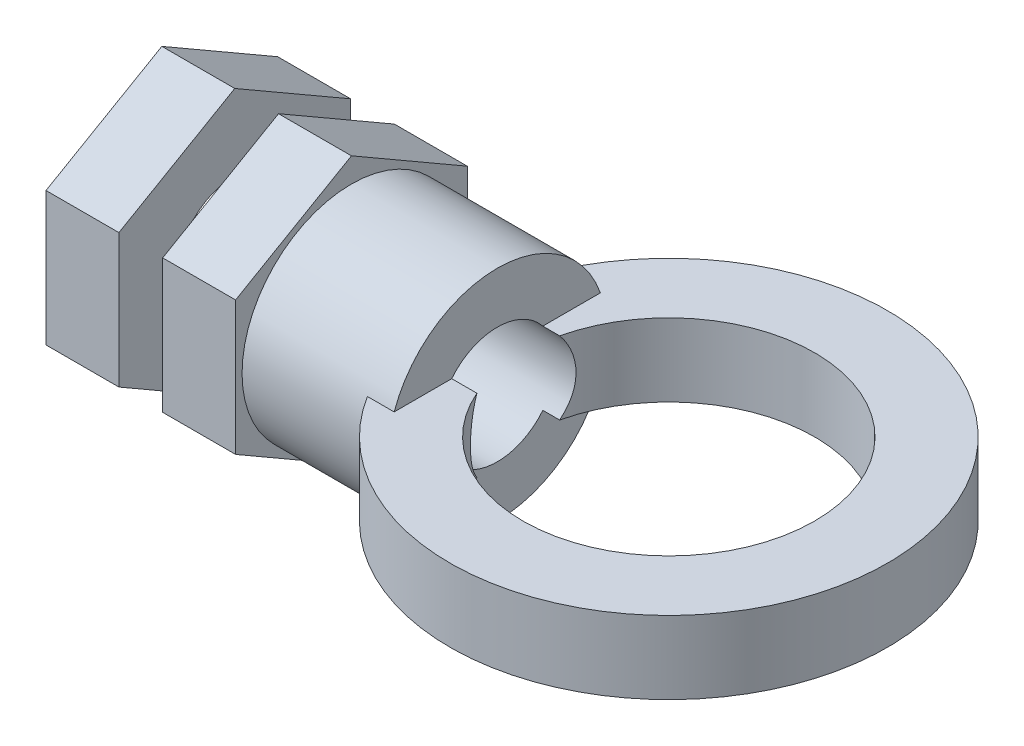
ISO-10303-21;
HEADER;
FILE_DESCRIPTION(('STEP AP214'),'2;1');
FILE_NAME('part.step','',(''),(''),'','','');
FILE_SCHEMA(('AUTOMOTIVE_DESIGN { 1 0 10303 214 1 1 1 1 }'));
ENDSEC;
DATA;
#1=APPLICATION_CONTEXT('core data for automotive mechanical design processes');
#2=APPLICATION_PROTOCOL_DEFINITION('international standard','automotive_design',2000,#1);
#3=PRODUCT_CONTEXT('',#1,'mechanical');
#4=PRODUCT('Part','Part','',(#3));
#5=PRODUCT_RELATED_PRODUCT_CATEGORY('part','',(#4));
#6=PRODUCT_DEFINITION_FORMATION('','',#4);
#7=PRODUCT_DEFINITION_CONTEXT('part definition',#1,'design');
#8=PRODUCT_DEFINITION('design','',#6,#7);
#9=PRODUCT_DEFINITION_SHAPE('','',#8);
#10=(LENGTH_UNIT() NAMED_UNIT(*) SI_UNIT(.MILLI.,.METRE.));
#11=(NAMED_UNIT(*) PLANE_ANGLE_UNIT() SI_UNIT($,.RADIAN.));
#12=(NAMED_UNIT(*) SI_UNIT($,.STERADIAN.) SOLID_ANGLE_UNIT());
#13=UNCERTAINTY_MEASURE_WITH_UNIT(LENGTH_MEASURE(1.E-05),#10,'distance_accuracy_value','');
#14=(GEOMETRIC_REPRESENTATION_CONTEXT(3) GLOBAL_UNCERTAINTY_ASSIGNED_CONTEXT((#13)) GLOBAL_UNIT_ASSIGNED_CONTEXT((#10,
#11,#12)) REPRESENTATION_CONTEXT('',''));
#15=CARTESIAN_POINT('',(0.,0.,0.));
#16=DIRECTION('',(0.,0.,1.));
#17=DIRECTION('',(1.,0.,0.));
#18=AXIS2_PLACEMENT_3D('',#15,#16,#17);
#19=CARTESIAN_POINT('',(-13.,-4.58670881317867,7.94441270394918));
#20=DIRECTION('',(0.,-0.866025403784442,0.499999999999995));
#21=DIRECTION('',(0.,-0.499999999999995,-0.866025403784442));
#22=AXIS2_PLACEMENT_3D('',#19,#20,#21);
#23=PLANE('',#22);
#24=DIRECTION('',(0.,-0.499999999999995,-0.866025403784442));
#25=VECTOR('',#24,1.);
#26=CARTESIAN_POINT('',(-8.,-4.58670881317867,7.94441270394918));
#27=LINE('',#26,#25);
#28=CARTESIAN_POINT('',(-8.,-4.58670881317867,7.94441270394918));
#29=VERTEX_POINT('',#28);
#30=CARTESIAN_POINT('',(-8.,-9.17341762635715,0.));
#31=VERTEX_POINT('',#30);
#32=EDGE_CURVE('E134',#29,#31,#27,.T.);
#33=ORIENTED_EDGE('',*,*,#32,.F.);
#34=DIRECTION('',(1.,0.,0.));
#35=VECTOR('',#34,1.);
#36=CARTESIAN_POINT('',(-13.,-4.58670881317867,7.94441270394918));
#37=LINE('',#36,#35);
#38=CARTESIAN_POINT('',(-13.,-4.58670881317867,7.94441270394918));
#39=VERTEX_POINT('',#38);
#40=EDGE_CURVE('E12',#39,#29,#37,.T.);
#41=ORIENTED_EDGE('',*,*,#40,.F.);
#42=DIRECTION('',(0.,-0.499999999999995,-0.866025403784442));
#43=VECTOR('',#42,1.);
#44=CARTESIAN_POINT('',(-13.,-4.58670881317867,7.94441270394918));
#45=LINE('',#44,#43);
#46=CARTESIAN_POINT('',(-13.,-9.17341762635715,0.));
#47=VERTEX_POINT('',#46);
#48=EDGE_CURVE('E148',#39,#47,#45,.T.);
#49=ORIENTED_EDGE('',*,*,#48,.T.);
#50=DIRECTION('',(1.,0.,0.));
#51=VECTOR('',#50,1.);
#52=CARTESIAN_POINT('',(-13.,-9.17341762635715,0.));
#53=LINE('',#52,#51);
#54=EDGE_CURVE('E98',#47,#31,#53,.T.);
#55=ORIENTED_EDGE('',*,*,#54,.T.);
#56=EDGE_LOOP('',(#33,#41,#49,#55));
#57=FACE_BOUND('',#56,.T.);
#58=ADVANCED_FACE('F48',(#57),#23,.T.);
#59=CARTESIAN_POINT('',(-13.,4.5867088131785,7.94441270394928));
#60=DIRECTION('',(0.,0.,1.));
#61=DIRECTION('',(0.,-1.,0.));
#62=AXIS2_PLACEMENT_3D('',#59,#60,#61);
#63=PLANE('',#62);
#64=DIRECTION('',(0.,-1.,0.));
#65=VECTOR('',#64,1.);
#66=CARTESIAN_POINT('',(-8.,4.5867088131785,7.94441270394928));
#67=LINE('',#66,#65);
#68=CARTESIAN_POINT('',(-8.,4.5867088131785,7.94441270394928));
#69=VERTEX_POINT('',#68);
#70=EDGE_CURVE('E146',#69,#29,#67,.T.);
#71=ORIENTED_EDGE('',*,*,#70,.F.);
#72=DIRECTION('',(1.,0.,0.));
#73=VECTOR('',#72,1.);
#74=CARTESIAN_POINT('',(-13.,4.5867088131785,7.94441270394928));
#75=LINE('',#74,#73);
#76=CARTESIAN_POINT('',(-13.,4.5867088131785,7.94441270394928));
#77=VERTEX_POINT('',#76);
#78=EDGE_CURVE('E57',#77,#69,#75,.T.);
#79=ORIENTED_EDGE('',*,*,#78,.F.);
#80=DIRECTION('',(0.,-1.,0.));
#81=VECTOR('',#80,1.);
#82=CARTESIAN_POINT('',(-13.,4.5867088131785,7.94441270394928));
#83=LINE('',#82,#81);
#84=EDGE_CURVE('E124',#77,#39,#83,.T.);
#85=ORIENTED_EDGE('',*,*,#84,.T.);
#86=ORIENTED_EDGE('',*,*,#40,.T.);
#87=EDGE_LOOP('',(#71,#79,#85,#86));
#88=FACE_BOUND('',#87,.T.);
#89=ADVANCED_FACE('F157',(#88),#63,.T.);
#90=CARTESIAN_POINT('',(-13.,9.17341762635715,0.));
#91=DIRECTION('',(0.,0.866025403784435,0.500000000000007));
#92=DIRECTION('',(0.,-0.500000000000007,0.866025403784435));
#93=AXIS2_PLACEMENT_3D('',#90,#91,#92);
#94=PLANE('',#93);
#95=DIRECTION('',(0.,-0.500000000000007,0.866025403784434));
#96=VECTOR('',#95,1.);
#97=CARTESIAN_POINT('',(-8.,9.17341762635715,0.));
#98=LINE('',#97,#96);
#99=CARTESIAN_POINT('',(-8.,9.17341762635715,0.));
#100=VERTEX_POINT('',#99);
#101=EDGE_CURVE('E111',#100,#69,#98,.T.);
#102=ORIENTED_EDGE('',*,*,#101,.F.);
#103=DIRECTION('',(1.,0.,0.));
#104=VECTOR('',#103,1.);
#105=CARTESIAN_POINT('',(-13.,9.17341762635715,0.));
#106=LINE('',#105,#104);
#107=CARTESIAN_POINT('',(-13.,9.17341762635715,0.));
#108=VERTEX_POINT('',#107);
#109=EDGE_CURVE('E106',#108,#100,#106,.T.);
#110=ORIENTED_EDGE('',*,*,#109,.F.);
#111=DIRECTION('',(0.,-0.500000000000007,0.866025403784434));
#112=VECTOR('',#111,1.);
#113=CARTESIAN_POINT('',(-13.,9.17341762635715,0.));
#114=LINE('',#113,#112);
#115=EDGE_CURVE('E109',#108,#77,#114,.T.);
#116=ORIENTED_EDGE('',*,*,#115,.T.);
#117=ORIENTED_EDGE('',*,*,#78,.T.);
#118=EDGE_LOOP('',(#102,#110,#116,#117));
#119=FACE_BOUND('',#118,.T.);
#120=ADVANCED_FACE('F108',(#119),#94,.T.);
#121=CARTESIAN_POINT('',(-13.,4.58670881317861,-7.94441270394922));
#122=DIRECTION('',(0.,0.866025403784442,-0.499999999999995));
#123=DIRECTION('',(0.,0.499999999999995,0.866025403784442));
#124=AXIS2_PLACEMENT_3D('',#121,#122,#123);
#125=PLANE('',#124);
#126=DIRECTION('',(0.,0.499999999999995,0.866025403784441));
#127=VECTOR('',#126,1.);
#128=CARTESIAN_POINT('',(-8.,4.58670881317861,-7.94441270394922));
#129=LINE('',#128,#127);
#130=CARTESIAN_POINT('',(-8.,4.58670881317861,-7.94441270394922));
#131=VERTEX_POINT('',#130);
#132=EDGE_CURVE('E143',#131,#100,#129,.T.);
#133=ORIENTED_EDGE('',*,*,#132,.F.);
#134=DIRECTION('',(1.,0.,0.));
#135=VECTOR('',#134,1.);
#136=CARTESIAN_POINT('',(-13.,4.58670881317861,-7.94441270394922));
#137=LINE('',#136,#135);
#138=CARTESIAN_POINT('',(-13.,4.58670881317861,-7.94441270394922));
#139=VERTEX_POINT('',#138);
#140=EDGE_CURVE('E116',#139,#131,#137,.T.);
#141=ORIENTED_EDGE('',*,*,#140,.F.);
#142=DIRECTION('',(0.,0.499999999999995,0.866025403784441));
#143=VECTOR('',#142,1.);
#144=CARTESIAN_POINT('',(-13.,4.58670881317861,-7.94441270394922));
#145=LINE('',#144,#143);
#146=EDGE_CURVE('E122',#139,#108,#145,.T.);
#147=ORIENTED_EDGE('',*,*,#146,.T.);
#148=ORIENTED_EDGE('',*,*,#109,.T.);
#149=EDGE_LOOP('',(#133,#141,#147,#148));
#150=FACE_BOUND('',#149,.T.);
#151=ADVANCED_FACE('F126',(#150),#125,.T.);
#152=CARTESIAN_POINT('',(-13.,-4.58670881317856,-7.94441270394925));
#153=DIRECTION('',(0.,0.,-1.));
#154=DIRECTION('',(0.,1.,0.));
#155=AXIS2_PLACEMENT_3D('',#152,#153,#154);
#156=PLANE('',#155);
#157=DIRECTION('',(0.,1.,0.));
#158=VECTOR('',#157,1.);
#159=CARTESIAN_POINT('',(-8.,-4.58670881317856,-7.94441270394925));
#160=LINE('',#159,#158);
#161=CARTESIAN_POINT('',(-8.,-4.58670881317856,-7.94441270394925));
#162=VERTEX_POINT('',#161);
#163=EDGE_CURVE('E140',#162,#131,#160,.T.);
#164=ORIENTED_EDGE('',*,*,#163,.F.);
#165=DIRECTION('',(1.,0.,0.));
#166=VECTOR('',#165,1.);
#167=CARTESIAN_POINT('',(-13.,-4.58670881317856,-7.94441270394925));
#168=LINE('',#167,#166);
#169=CARTESIAN_POINT('',(-13.,-4.58670881317856,-7.94441270394925));
#170=VERTEX_POINT('',#169);
#171=EDGE_CURVE('E152',#170,#162,#168,.T.);
#172=ORIENTED_EDGE('',*,*,#171,.F.);
#173=DIRECTION('',(0.,1.,0.));
#174=VECTOR('',#173,1.);
#175=CARTESIAN_POINT('',(-13.,-4.58670881317856,-7.94441270394925));
#176=LINE('',#175,#174);
#177=EDGE_CURVE('E127',#170,#139,#176,.T.);
#178=ORIENTED_EDGE('',*,*,#177,.T.);
#179=ORIENTED_EDGE('',*,*,#140,.T.);
#180=EDGE_LOOP('',(#164,#172,#178,#179));
#181=FACE_BOUND('',#180,.T.);
#182=ADVANCED_FACE('F170',(#181),#156,.T.);
#183=CARTESIAN_POINT('',(-13.,-9.17341762635715,0.));
#184=DIRECTION('',(0.,-0.866025403784438,-0.500000000000001));
#185=DIRECTION('',(0.,0.500000000000001,-0.866025403784438));
#186=AXIS2_PLACEMENT_3D('',#183,#184,#185);
#187=PLANE('',#186);
#188=DIRECTION('',(0.,0.500000000000001,-0.866025403784438));
#189=VECTOR('',#188,1.);
#190=CARTESIAN_POINT('',(-8.,-9.17341762635715,0.));
#191=LINE('',#190,#189);
#192=EDGE_CURVE('E137',#31,#162,#191,.T.);
#193=ORIENTED_EDGE('',*,*,#192,.F.);
#194=ORIENTED_EDGE('',*,*,#54,.F.);
#195=DIRECTION('',(0.,0.500000000000001,-0.866025403784438));
#196=VECTOR('',#195,1.);
#197=CARTESIAN_POINT('',(-13.,-9.17341762635715,0.));
#198=LINE('',#197,#196);
#199=EDGE_CURVE('E129',#47,#170,#198,.T.);
#200=ORIENTED_EDGE('',*,*,#199,.T.);
#201=ORIENTED_EDGE('',*,*,#171,.T.);
#202=EDGE_LOOP('',(#193,#194,#200,#201));
#203=FACE_BOUND('',#202,.T.);
#204=ADVANCED_FACE('F153',(#203),#187,.T.);
#205=CARTESIAN_POINT('',(-13.,0.,0.));
#206=DIRECTION('',(1.,0.,0.));
#207=DIRECTION('',(0.,0.,-1.));
#208=AXIS2_PLACEMENT_3D('',#205,#206,#207);
#209=PLANE('',#208);
#210=CARTESIAN_POINT('',(-13.,0.,0.));
#211=DIRECTION('',(1.,0.,0.));
#212=DIRECTION('',(0.,0.,-1.));
#213=AXIS2_PLACEMENT_3D('',#210,#211,#212);
#214=CIRCLE('',#213,4.);
#215=CARTESIAN_POINT('',(-13.,0.,-4.));
#216=VERTEX_POINT('',#215);
#217=EDGE_CURVE('E193',#216,#216,#214,.T.);
#218=ORIENTED_EDGE('',*,*,#217,.T.);
#219=EDGE_LOOP('',(#218));
#220=FACE_BOUND('',#219,.T.);
#221=ORIENTED_EDGE('',*,*,#48,.F.);
#222=ORIENTED_EDGE('',*,*,#84,.F.);
#223=ORIENTED_EDGE('',*,*,#115,.F.);
#224=ORIENTED_EDGE('',*,*,#146,.F.);
#225=ORIENTED_EDGE('',*,*,#177,.F.);
#226=ORIENTED_EDGE('',*,*,#199,.F.);
#227=EDGE_LOOP('',(#221,#222,#223,#224,#225,#226));
#228=FACE_BOUND('',#227,.T.);
#229=ADVANCED_FACE('F120',(#220,#228),#209,.F.);
#230=CARTESIAN_POINT('',(-8.,0.,0.));
#231=DIRECTION('',(1.,0.,0.));
#232=DIRECTION('',(0.,0.,-1.));
#233=AXIS2_PLACEMENT_3D('',#230,#231,#232);
#234=PLANE('',#233);
#235=CARTESIAN_POINT('',(-8.,0.,0.));
#236=DIRECTION('',(1.,0.,0.));
#237=DIRECTION('',(0.,0.,-1.));
#238=AXIS2_PLACEMENT_3D('',#235,#236,#237);
#239=CIRCLE('',#238,4.);
#240=CARTESIAN_POINT('',(-8.,0.,-4.));
#241=VERTEX_POINT('',#240);
#242=EDGE_CURVE('E51',#241,#241,#239,.T.);
#243=ORIENTED_EDGE('',*,*,#242,.F.);
#244=EDGE_LOOP('',(#243));
#245=FACE_BOUND('',#244,.T.);
#246=ORIENTED_EDGE('',*,*,#32,.T.);
#247=ORIENTED_EDGE('',*,*,#192,.T.);
#248=ORIENTED_EDGE('',*,*,#163,.T.);
#249=ORIENTED_EDGE('',*,*,#132,.T.);
#250=ORIENTED_EDGE('',*,*,#101,.T.);
#251=ORIENTED_EDGE('',*,*,#70,.T.);
#252=EDGE_LOOP('',(#246,#247,#248,#249,#250,#251));
#253=FACE_BOUND('',#252,.T.);
#254=ADVANCED_FACE('F156',(#245,#253),#234,.T.);
#255=CARTESIAN_POINT('',(-13.,0.,0.));
#256=DIRECTION('',(1.,0.,0.));
#257=DIRECTION('',(0.,0.,-1.));
#258=AXIS2_PLACEMENT_3D('',#255,#256,#257);
#259=CYLINDRICAL_SURFACE('',#258,4.);
#260=ORIENTED_EDGE('',*,*,#242,.T.);
#261=EDGE_LOOP('',(#260));
#262=FACE_BOUND('',#261,.T.);
#263=ORIENTED_EDGE('',*,*,#217,.F.);
#264=EDGE_LOOP('',(#263));
#265=FACE_BOUND('',#264,.T.);
#266=ADVANCED_FACE('F181',(#262,#265),#259,.F.);
#267=CLOSED_SHELL('',(#58,#89,#120,#151,#182,#204,#229,#254,#266));
#268=MANIFOLD_SOLID_BREP('B2',#267);
#269=CARTESIAN_POINT('',(20.8966829811401,2.5,-0.863950162018484));
#270=DIRECTION('',(0.,1.,0.));
#271=DIRECTION('',(0.,0.,1.));
#272=AXIS2_PLACEMENT_3D('',#269,#270,#271);
#273=PLANE('',#272);
#274=DIRECTION('',(0.,0.,1.));
#275=VECTOR('',#274,1.);
#276=CARTESIAN_POINT('',(10.,2.5,0.));
#277=LINE('',#276,#275);
#278=CARTESIAN_POINT('',(10.,2.5,-7.07106781186548));
#279=VERTEX_POINT('',#278);
#280=CARTESIAN_POINT('',(10.,2.5,-3.1224989991992));
#281=VERTEX_POINT('',#280);
#282=EDGE_CURVE('E588',#279,#281,#277,.T.);
#283=ORIENTED_EDGE('',*,*,#282,.T.);
#284=DIRECTION('',(-1.,0.,0.));
#285=VECTOR('',#284,1.);
#286=CARTESIAN_POINT('',(35.8976829811401,2.5,-3.1224989991992));
#287=LINE('',#286,#285);
#288=CARTESIAN_POINT('',(11.1550734041723,2.5,-3.1224989991992));
#289=VERTEX_POINT('',#288);
#290=EDGE_CURVE('E499',#289,#281,#287,.T.);
#291=ORIENTED_EDGE('',*,*,#290,.F.);
#292=CARTESIAN_POINT('',(20.8966829811401,2.5,-0.863950162018484));
#293=DIRECTION('',(0.,1.,0.));
#294=DIRECTION('',(0.,0.,1.));
#295=AXIS2_PLACEMENT_3D('',#292,#293,#294);
#296=CIRCLE('',#295,10.);
#297=CARTESIAN_POINT('',(11.7256294383334,2.5,3.1224989991992));
#298=VERTEX_POINT('',#297);
#299=EDGE_CURVE('E394',#298,#289,#296,.T.);
#300=ORIENTED_EDGE('',*,*,#299,.F.);
#301=DIRECTION('',(-1.,0.,0.));
#302=VECTOR('',#301,1.);
#303=CARTESIAN_POINT('',(10.,2.5,3.1224989991992));
#304=LINE('',#303,#302);
#305=CARTESIAN_POINT('',(10.,2.5,3.1224989991992));
#306=VERTEX_POINT('',#305);
#307=EDGE_CURVE('E274',#306,#298,#304,.F.);
#308=ORIENTED_EDGE('',*,*,#307,.F.);
#309=CARTESIAN_POINT('',(10.,2.5,7.07106781186548));
#310=VERTEX_POINT('',#309);
#311=EDGE_CURVE('E592',#306,#310,#277,.T.);
#312=ORIENTED_EDGE('',*,*,#311,.T.);
#313=DIRECTION('',(-1.,0.,0.));
#314=VECTOR('',#313,1.);
#315=CARTESIAN_POINT('',(10.,2.5,7.07106781186548));
#316=LINE('',#315,#314);
#317=CARTESIAN_POINT('',(8.16736682691801,2.5,7.07106781186548));
#318=VERTEX_POINT('',#317);
#319=EDGE_CURVE('E595',#318,#310,#316,.F.);
#320=ORIENTED_EDGE('',*,*,#319,.F.);
#321=CARTESIAN_POINT('',(20.8966829811401,2.5,-0.863950162018484));
#322=DIRECTION('',(0.,1.,0.));
#323=DIRECTION('',(0.,0.,1.));
#324=AXIS2_PLACEMENT_3D('',#321,#322,#323);
#325=CIRCLE('',#324,15.);
#326=CARTESIAN_POINT('',(7.24121922186194,2.5,-7.07106781186548));
#327=VERTEX_POINT('',#326);
#328=EDGE_CURVE('E406',#318,#327,#325,.T.);
#329=ORIENTED_EDGE('',*,*,#328,.T.);
#330=DIRECTION('',(-1.,0.,0.));
#331=VECTOR('',#330,1.);
#332=CARTESIAN_POINT('',(10.,2.5,-7.07106781186548));
#333=LINE('',#332,#331);
#334=EDGE_CURVE('E584',#279,#327,#333,.T.);
#335=ORIENTED_EDGE('',*,*,#334,.F.);
#336=EDGE_LOOP('',(#283,#291,#300,#308,#312,#320,#329,#335));
#337=FACE_BOUND('',#336,.T.);
#338=ADVANCED_FACE('F244',(#337),#273,.T.);
#339=CARTESIAN_POINT('',(20.8966829811401,-2.5,-0.863950162018484));
#340=DIRECTION('',(0.,1.,0.));
#341=DIRECTION('',(0.,0.,1.));
#342=AXIS2_PLACEMENT_3D('',#339,#340,#341);
#343=PLANE('',#342);
#344=DIRECTION('',(-1.,0.,0.));
#345=VECTOR('',#344,1.);
#346=CARTESIAN_POINT('',(35.8976829811401,-2.5,-3.1224989991992));
#347=LINE('',#346,#345);
#348=CARTESIAN_POINT('',(11.1550734041723,-2.5,-3.1224989991992));
#349=VERTEX_POINT('',#348);
#350=CARTESIAN_POINT('',(10.,-2.5,-3.1224989991992));
#351=VERTEX_POINT('',#350);
#352=EDGE_CURVE('E265',#349,#351,#347,.T.);
#353=ORIENTED_EDGE('',*,*,#352,.T.);
#354=DIRECTION('',(0.,0.,1.));
#355=VECTOR('',#354,1.);
#356=CARTESIAN_POINT('',(10.,-2.5,0.));
#357=LINE('',#356,#355);
#358=CARTESIAN_POINT('',(10.,-2.5,-7.07106781186548));
#359=VERTEX_POINT('',#358);
#360=EDGE_CURVE('E593',#359,#351,#357,.T.);
#361=ORIENTED_EDGE('',*,*,#360,.F.);
#362=DIRECTION('',(-1.,0.,0.));
#363=VECTOR('',#362,1.);
#364=CARTESIAN_POINT('',(10.,-2.5,-7.07106781186548));
#365=LINE('',#364,#363);
#366=CARTESIAN_POINT('',(7.24121922186194,-2.5,-7.07106781186548));
#367=VERTEX_POINT('',#366);
#368=EDGE_CURVE('E590',#359,#367,#365,.T.);
#369=ORIENTED_EDGE('',*,*,#368,.T.);
#370=CARTESIAN_POINT('',(20.8966829811401,-2.5,-0.863950162018484));
#371=DIRECTION('',(0.,1.,0.));
#372=DIRECTION('',(0.,0.,1.));
#373=AXIS2_PLACEMENT_3D('',#370,#371,#372);
#374=CIRCLE('',#373,15.);
#375=CARTESIAN_POINT('',(8.16736682691801,-2.5,7.07106781186548));
#376=VERTEX_POINT('',#375);
#377=EDGE_CURVE('E399',#376,#367,#374,.T.);
#378=ORIENTED_EDGE('',*,*,#377,.F.);
#379=DIRECTION('',(-1.,0.,0.));
#380=VECTOR('',#379,1.);
#381=CARTESIAN_POINT('',(10.,-2.5,7.07106781186548));
#382=LINE('',#381,#380);
#383=CARTESIAN_POINT('',(10.,-2.5,7.07106781186548));
#384=VERTEX_POINT('',#383);
#385=EDGE_CURVE('E599',#376,#384,#382,.F.);
#386=ORIENTED_EDGE('',*,*,#385,.T.);
#387=CARTESIAN_POINT('',(10.,-2.5,3.1224989991992));
#388=VERTEX_POINT('',#387);
#389=EDGE_CURVE('E388',#388,#384,#357,.T.);
#390=ORIENTED_EDGE('',*,*,#389,.F.);
#391=DIRECTION('',(-1.,0.,0.));
#392=VECTOR('',#391,1.);
#393=CARTESIAN_POINT('',(10.,-2.5,3.1224989991992));
#394=LINE('',#393,#392);
#395=CARTESIAN_POINT('',(11.7256294383334,-2.5,3.1224989991992));
#396=VERTEX_POINT('',#395);
#397=EDGE_CURVE('E374',#388,#396,#394,.F.);
#398=ORIENTED_EDGE('',*,*,#397,.T.);
#399=CARTESIAN_POINT('',(20.8966829811401,-2.5,-0.863950162018484));
#400=DIRECTION('',(0.,1.,0.));
#401=DIRECTION('',(0.,0.,1.));
#402=AXIS2_PLACEMENT_3D('',#399,#400,#401);
#403=CIRCLE('',#402,10.);
#404=EDGE_CURVE('E386',#396,#349,#403,.T.);
#405=ORIENTED_EDGE('',*,*,#404,.T.);
#406=EDGE_LOOP('',(#353,#361,#369,#378,#386,#390,#398,#405));
#407=FACE_BOUND('',#406,.T.);
#408=ADVANCED_FACE('F385',(#407),#343,.F.);
#409=CARTESIAN_POINT('',(20.8966829811401,2.5,-0.863950162018484));
#410=DIRECTION('',(0.,-1.,0.));
#411=DIRECTION('',(0.,0.,-1.));
#412=AXIS2_PLACEMENT_3D('',#409,#410,#411);
#413=CYLINDRICAL_SURFACE('',#412,10.);
#414=ORIENTED_EDGE('',*,*,#299,.T.);
#415=CARTESIAN_POINT('',(11.1550734041723,-2.5,-3.1224989991992));
#416=CARTESIAN_POINT('',(11.1711047959282,-2.41365569064392,-3.1916371907947));
#417=CARTESIAN_POINT('',(11.187076686113,-2.32442984570626,-3.25718956653525));
#418=CARTESIAN_POINT('',(11.2183640865082,-2.14076130782328,-3.38073691388922));
#419=CARTESIAN_POINT('',(11.2336794891403,-2.04631776561571,-3.4387306500244));
#420=CARTESIAN_POINT('',(11.2631383039679,-1.85260875052396,-3.54685250731059));
#421=CARTESIAN_POINT('',(11.2772794847853,-1.75333464107608,-3.59696580770721));
#422=CARTESIAN_POINT('',(11.3038528312673,-1.55080546493876,-3.68881885541355));
#423=CARTESIAN_POINT('',(11.3162851096974,-1.44755066149979,-3.73055915531627));
#424=CARTESIAN_POINT('',(11.3503458300306,-1.13241868606765,-3.84282269894371));
#425=CARTESIAN_POINT('',(11.3687125611388,-0.915333925343329,-3.9002992370887));
#426=CARTESIAN_POINT('',(11.3938426977655,-0.474388683388496,-3.97806804919957));
#427=CARTESIAN_POINT('',(11.4006255589093,-0.25054020709222,-3.99842267498202));
#428=CARTESIAN_POINT('',(11.401594642582,0.189771596417124,-4.00135011255009));
#429=CARTESIAN_POINT('',(11.3962024853087,0.406226488646925,-3.9851875016565));
#430=CARTESIAN_POINT('',(11.3744457489925,0.833538991642044,-3.91816504912554));
#431=CARTESIAN_POINT('',(11.3580640733559,1.04438734804144,-3.86725114210757));
#432=CARTESIAN_POINT('',(11.3259213768515,1.36288446149891,-3.76256876552875));
#433=CARTESIAN_POINT('',(11.3131260097547,1.47471671622762,-3.72014543138455));
#434=CARTESIAN_POINT('',(11.2854423199936,1.69397372504369,-3.62556085734563));
#435=CARTESIAN_POINT('',(11.2705535789753,1.80139759257205,-3.57339767028817));
#436=CARTESIAN_POINT('',(11.2393113380217,2.01089703148466,-3.45983840585193));
#437=CARTESIAN_POINT('',(11.2229590207355,2.11297681732101,-3.39844975638862));
#438=CARTESIAN_POINT('',(11.1894521305719,2.31114620897193,-3.26691860854801));
#439=CARTESIAN_POINT('',(11.1722978093379,2.40723767194604,-3.19677884461805));
#440=CARTESIAN_POINT('',(11.1550734041723,2.5,-3.1224989991992));
#441=B_SPLINE_CURVE_WITH_KNOTS('',3,(#415,#416,#417,#418,#419,#420,#421,#422,#423,#424,#425,
#426,#427,#428,#429,#430,#431,#432,#433,#434,#435,#436,#437,#438,#439,#440),.UNSPECIFIED.,.F.,
.F.,(4,2,2,2,2,2,2,2,2,2,2,2,4),(0.,0.33521254045292,0.67047980369055,1.00637025229598,
1.34223852583685,2.01452303691849,2.68567730173092,3.33394730796645,3.98322818569844,
4.34367845123256,4.70420085422778,5.06443452125359,5.4245559072028),.UNSPECIFIED.);
#442=EDGE_CURVE('E381',#349,#289,#441,.T.);
#443=ORIENTED_EDGE('',*,*,#442,.F.);
#444=ORIENTED_EDGE('',*,*,#404,.F.);
#445=CARTESIAN_POINT('',(11.7256294383334,2.5,3.1224989991992));
#446=CARTESIAN_POINT('',(11.7544347532719,2.41723204659727,3.18876966927931));
#447=CARTESIAN_POINT('',(11.7827078998132,2.33170030923589,3.25184575445293));
#448=CARTESIAN_POINT('',(11.8375740196326,2.15546996890675,3.37124286742162));
#449=CARTESIAN_POINT('',(11.86416612347,2.06476873763477,3.42756041298866));
#450=CARTESIAN_POINT('',(11.9151362399929,1.87823316987535,3.53323955400192));
#451=CARTESIAN_POINT('',(11.9395039108432,1.78237785333505,3.58256919423264));
#452=CARTESIAN_POINT('',(11.9852474610661,1.58640968222146,3.67355032936585));
#453=CARTESIAN_POINT('',(12.0066236822174,1.48629731573091,3.71520270158313));
#454=CARTESIAN_POINT('',(12.0458523699219,1.28196726562445,3.79057583200236));
#455=CARTESIAN_POINT('',(12.0636899715308,1.17773438143626,3.82426324020739));
#456=CARTESIAN_POINT('',(12.0951567170856,0.966311938611622,3.88307517085659));
#457=CARTESIAN_POINT('',(12.1087880761714,0.859123968728352,3.90820420113833));
#458=CARTESIAN_POINT('',(12.1313634259847,0.642804662939698,3.94954423281828));
#459=CARTESIAN_POINT('',(12.1403179628152,0.533678278208088,3.965775303008));
#460=CARTESIAN_POINT('',(12.15326225323,0.314169418810279,3.98916996916193));
#461=CARTESIAN_POINT('',(12.157252491065,0.203787067719547,3.99633444954245));
#462=CARTESIAN_POINT('',(12.1600076691512,-0.00842198860329965,4.00128457215852));
#463=CARTESIAN_POINT('',(12.159164455501,-0.110227967008238,3.99977351976161));
#464=CARTESIAN_POINT('',(12.1531792425224,-0.313336904936182,3.98900566110849));
#465=CARTESIAN_POINT('',(12.1480357737709,-0.414639680607435,3.97974620717592));
#466=CARTESIAN_POINT('',(12.1336029919811,-0.616012008759646,3.95358582263662));
#467=CARTESIAN_POINT('',(12.1243114149727,-0.716080857093008,3.93668071909282));
#468=CARTESIAN_POINT('',(12.1018664666469,-0.914246255200497,3.89543480081613));
#469=CARTESIAN_POINT('',(12.0887116754827,-1.01234206563574,3.87109125209874));
#470=CARTESIAN_POINT('',(12.044577791769,-1.29890336131587,3.78837629090086));
#471=CARTESIAN_POINT('',(12.0086086647368,-1.4837471222684,3.7197694486478));
#472=CARTESIAN_POINT('',(11.9267357537809,-1.83935059483153,3.55738806713516));
#473=CARTESIAN_POINT('',(11.8808404346063,-2.01012213648635,3.4636349555758));
#474=CARTESIAN_POINT('',(11.81483069222,-2.229203566616,3.32193100857093));
#475=CARTESIAN_POINT('',(11.7973666442357,-2.28491205733462,3.28385796655169));
#476=CARTESIAN_POINT('',(11.7618839742297,-2.39410551281329,3.20511688476901));
#477=CARTESIAN_POINT('',(11.7438664951724,-2.44759458594584,3.16445402860061));
#478=CARTESIAN_POINT('',(11.7256294383334,-2.5,3.1224989991992));
#479=B_SPLINE_CURVE_WITH_KNOTS('',3,(#445,#446,#447,#448,#449,#450,#451,#452,#453,#454,#455,
#456,#457,#458,#459,#460,#461,#462,#463,#464,#465,#466,#467,#468,#469,#470,#471,#472,#473,#474,
#475,#476,#477,#478),.UNSPECIFIED.,.F.,.F.,(4,2,2,2,2,2,2,2,2,2,2,2,2,2,2,2,4),(0.,
0.329560832663919,0.659290743755665,0.990482912103069,1.32163721018504,1.65415445218419,
1.98649628006605,2.31808541509806,2.64964220219587,2.95472071595113,3.25990351949519,
3.56525309086497,3.87071502808498,4.46933158372124,5.06743965646408,5.27647433342888,
5.48510302525889),.UNSPECIFIED.);
#480=EDGE_CURVE('E370',#298,#396,#479,.T.);
#481=ORIENTED_EDGE('',*,*,#480,.F.);
#482=EDGE_LOOP('',(#414,#443,#444,#481));
#483=FACE_BOUND('',#482,.T.);
#484=ADVANCED_FACE('F392',(#483),#413,.F.);
#485=CARTESIAN_POINT('',(10.,0.,0.));
#486=DIRECTION('',(1.,0.,0.));
#487=DIRECTION('',(0.,0.,-1.));
#488=AXIS2_PLACEMENT_3D('',#485,#486,#487);
#489=PLANE('',#488);
#490=CARTESIAN_POINT('',(10.,0.,0.));
#491=DIRECTION('',(1.,0.,0.));
#492=DIRECTION('',(0.,0.,-1.));
#493=AXIS2_PLACEMENT_3D('',#490,#491,#492);
#494=CIRCLE('',#493,7.5);
#495=EDGE_CURVE('E255',#384,#359,#494,.T.);
#496=ORIENTED_EDGE('',*,*,#495,.T.);
#497=ORIENTED_EDGE('',*,*,#360,.T.);
#498=CARTESIAN_POINT('',(10.,0.,0.));
#499=DIRECTION('',(1.,0.,0.));
#500=DIRECTION('',(0.,0.,-1.));
#501=AXIS2_PLACEMENT_3D('',#498,#499,#500);
#502=CIRCLE('',#501,4.);
#503=EDGE_CURVE('E587',#388,#351,#502,.T.);
#504=ORIENTED_EDGE('',*,*,#503,.F.);
#505=ORIENTED_EDGE('',*,*,#389,.T.);
#506=EDGE_LOOP('',(#496,#497,#504,#505));
#507=FACE_BOUND('',#506,.T.);
#508=ADVANCED_FACE('F436',(#507),#489,.T.);
#509=ORIENTED_EDGE('',*,*,#282,.F.);
#510=EDGE_CURVE('E46',#279,#310,#494,.T.);
#511=ORIENTED_EDGE('',*,*,#510,.T.);
#512=ORIENTED_EDGE('',*,*,#311,.F.);
#513=EDGE_CURVE('E601',#281,#306,#502,.T.);
#514=ORIENTED_EDGE('',*,*,#513,.F.);
#515=EDGE_LOOP('',(#509,#511,#512,#514));
#516=FACE_BOUND('',#515,.T.);
#517=ADVANCED_FACE('F434',(#516),#489,.T.);
#518=CARTESIAN_POINT('',(10.,0.,0.));
#519=DIRECTION('',(-1.,0.,0.));
#520=DIRECTION('',(0.,0.,1.));
#521=AXIS2_PLACEMENT_3D('',#518,#519,#520);
#522=CYLINDRICAL_SURFACE('',#521,7.5);
#523=CARTESIAN_POINT('',(8.16736682691801,2.5,7.07106781186548));
#524=CARTESIAN_POINT('',(8.20421095946433,2.33295497594409,7.1301478536094));
#525=CARTESIAN_POINT('',(8.23802397009965,2.16316626008942,7.18349702067452));
#526=CARTESIAN_POINT('',(8.29875863346603,1.8189927962436,7.27825975984305));
#527=CARTESIAN_POINT('',(8.32567663057597,1.64460566406332,7.31966700199591));
#528=CARTESIAN_POINT('',(8.37173046286589,1.29246545139388,7.38997654452525));
#529=CARTESIAN_POINT('',(8.39087333966087,1.11471556982116,7.41889016140041));
#530=CARTESIAN_POINT('',(8.4207883765158,0.756936510963137,7.46388237915232));
#531=CARTESIAN_POINT('',(8.43156248399149,0.57690787386066,7.47996396607102));
#532=CARTESIAN_POINT('',(8.44439692486649,0.215221140069396,7.49910583183231));
#533=CARTESIAN_POINT('',(8.44642705563693,0.0335595640131709,7.50212097801412));
#534=CARTESIAN_POINT('',(8.44161926794536,-0.32938646863794,7.49496161969465));
#535=CARTESIAN_POINT('',(8.43478126673654,-0.510670921698156,7.48478699212217));
#536=CARTESIAN_POINT('',(8.41249204235734,-0.871259197471739,7.45141966104872));
#537=CARTESIAN_POINT('',(8.39705179674086,-1.05056524807488,7.42824354882934));
#538=CARTESIAN_POINT('',(8.35809201034865,-1.40611327221318,7.3692133493915));
#539=CARTESIAN_POINT('',(8.33457568864446,-1.58235643723317,7.33336431335138));
#540=CARTESIAN_POINT('',(8.28766777413999,-1.88294493218603,7.26095282071997));
#541=CARTESIAN_POINT('',(8.26600953520505,-2.00827156849266,7.22728046307146));
#542=CARTESIAN_POINT('',(8.21921380310881,-2.2562009023113,7.15375825330174));
#543=CARTESIAN_POINT('',(8.19408229860422,-2.37880787565296,7.11391902030294));
#544=CARTESIAN_POINT('',(8.16736682691801,-2.5,7.07106781186547));
#545=B_SPLINE_CURVE_WITH_KNOTS('',3,(#523,#524,#525,#526,#527,#528,#529,#530,#531,#532,#533,
#534,#535,#536,#537,#538,#539,#540,#541,#542,#543,#544),.UNSPECIFIED.,.F.,.F.,(4,2,2,2,2,2,2,2,
2,2,4),(0.,0.542856759863726,1.08600074036504,1.62865171435109,2.17117637539098,
2.71557347925976,3.25997566282759,3.8036847062789,4.34717728188251,4.74166696888479,
5.13548476518983),.UNSPECIFIED.);
#546=EDGE_CURVE('E419',#318,#376,#545,.T.);
#547=ORIENTED_EDGE('',*,*,#546,.F.);
#548=ORIENTED_EDGE('',*,*,#319,.T.);
#549=ORIENTED_EDGE('',*,*,#510,.F.);
#550=ORIENTED_EDGE('',*,*,#334,.T.);
#551=CARTESIAN_POINT('',(7.24121922186194,-2.5,-7.07106781186548));
#552=CARTESIAN_POINT('',(7.27014717095199,-2.32019118888495,-7.13466271290145));
#553=CARTESIAN_POINT('',(7.29649900712846,-2.13754549714257,-7.19149892134172));
#554=CARTESIAN_POINT('',(7.34332948706642,-1.76768768545462,-7.29122022037719));
#555=CARTESIAN_POINT('',(7.36380620190414,-1.58047408761068,-7.33410072964716));
#556=CARTESIAN_POINT('',(7.39814751002665,-1.20268561674134,-7.40543868189835));
#557=CARTESIAN_POINT('',(7.41201134525311,-1.01211036095229,-7.43389447134518));
#558=CARTESIAN_POINT('',(7.43263683996811,-0.628984180496964,-7.47606222576621));
#559=CARTESIAN_POINT('',(7.43939974037241,-0.436433606965836,-7.4897767668404));
#560=CARTESIAN_POINT('',(7.44558505073786,-0.050294467717582,-7.50232435257276));
#561=CARTESIAN_POINT('',(7.44499090720581,0.143295458768004,-7.50112383804298));
#562=CARTESIAN_POINT('',(7.43644416860724,0.529641984551264,-7.48377373242321));
#563=CARTESIAN_POINT('',(7.4284915098625,0.722398576623029,-7.4676240119676));
#564=CARTESIAN_POINT('',(7.40554275429078,1.10528566990774,-7.42061196165817));
#565=CARTESIAN_POINT('',(7.39056051763331,1.29542058423506,-7.38977858168793));
#566=CARTESIAN_POINT('',(7.35409210403477,1.67207762524248,-7.31375685702858));
#567=CARTESIAN_POINT('',(7.33260933730508,1.85860159178689,-7.26857603846624));
#568=CARTESIAN_POINT('',(7.29803817004596,2.11986287930653,-7.1946241605418));
#569=CARTESIAN_POINT('',(7.28732496858,2.19658134043043,-7.17157158025218));
#570=CARTESIAN_POINT('',(7.26496138644357,2.34902578347614,-7.12309371462231));
#571=CARTESIAN_POINT('',(7.25331212227359,2.42475282608381,-7.09767125035895));
#572=CARTESIAN_POINT('',(7.24121922186194,2.5,-7.07106781186547));
#573=B_SPLINE_CURVE_WITH_KNOTS('',3,(#551,#552,#553,#554,#555,#556,#557,#558,#559,#560,#561,
#562,#563,#564,#565,#566,#567,#568,#569,#570,#571,#572),.UNSPECIFIED.,.F.,.F.,(4,2,2,2,2,2,2,2,
2,2,4),(0.,0.578605398758758,1.15740054881444,1.73626203231673,2.31502234069516,
2.89508510730042,3.47515289362911,4.05408173992355,4.63270740217421,4.87513124415791,
5.11727010612355),.UNSPECIFIED.);
#574=EDGE_CURVE('E409',#367,#327,#573,.T.);
#575=ORIENTED_EDGE('',*,*,#574,.F.);
#576=ORIENTED_EDGE('',*,*,#368,.F.);
#577=ORIENTED_EDGE('',*,*,#495,.F.);
#578=ORIENTED_EDGE('',*,*,#385,.F.);
#579=EDGE_LOOP('',(#547,#548,#549,#550,#575,#576,#577,#578));
#580=FACE_BOUND('',#579,.T.);
#581=CARTESIAN_POINT('',(0.,0.,0.));
#582=DIRECTION('',(1.,0.,0.));
#583=DIRECTION('',(0.,0.,-1.));
#584=AXIS2_PLACEMENT_3D('',#581,#582,#583);
#585=CIRCLE('',#584,7.5);
#586=CARTESIAN_POINT('',(0.,0.,-7.5));
#587=VERTEX_POINT('',#586);
#588=EDGE_CURVE('E395',#587,#587,#585,.T.);
#589=ORIENTED_EDGE('',*,*,#588,.T.);
#590=EDGE_LOOP('',(#589));
#591=FACE_BOUND('',#590,.T.);
#592=ADVANCED_FACE('F246',(#580,#591),#522,.T.);
#593=CARTESIAN_POINT('',(10.,0.,0.));
#594=DIRECTION('',(-1.,0.,0.));
#595=DIRECTION('',(0.,0.,1.));
#596=AXIS2_PLACEMENT_3D('',#593,#594,#595);
#597=CYLINDRICAL_SURFACE('',#596,4.);
#598=ORIENTED_EDGE('',*,*,#513,.T.);
#599=ORIENTED_EDGE('',*,*,#307,.T.);
#600=ORIENTED_EDGE('',*,*,#480,.T.);
#601=ORIENTED_EDGE('',*,*,#397,.F.);
#602=ORIENTED_EDGE('',*,*,#503,.T.);
#603=ORIENTED_EDGE('',*,*,#352,.F.);
#604=ORIENTED_EDGE('',*,*,#442,.T.);
#605=ORIENTED_EDGE('',*,*,#290,.T.);
#606=EDGE_LOOP('',(#598,#599,#600,#601,#602,#603,#604,#605));
#607=FACE_BOUND('',#606,.T.);
#608=CARTESIAN_POINT('',(-5.,0.,0.));
#609=DIRECTION('',(1.,0.,0.));
#610=DIRECTION('',(0.,0.,-1.));
#611=AXIS2_PLACEMENT_3D('',#608,#609,#610);
#612=CIRCLE('',#611,4.);
#613=CARTESIAN_POINT('',(-5.,0.,-4.));
#614=VERTEX_POINT('',#613);
#615=EDGE_CURVE('E249',#614,#614,#612,.T.);
#616=ORIENTED_EDGE('',*,*,#615,.F.);
#617=EDGE_LOOP('',(#616));
#618=FACE_BOUND('',#617,.T.);
#619=ADVANCED_FACE('F372',(#607,#618),#597,.F.);
#620=CARTESIAN_POINT('',(20.8966829811401,2.5,-0.863950162018484));
#621=DIRECTION('',(0.,-1.,0.));
#622=DIRECTION('',(0.,0.,-1.));
#623=AXIS2_PLACEMENT_3D('',#620,#621,#622);
#624=CYLINDRICAL_SURFACE('',#623,15.);
#625=ORIENTED_EDGE('',*,*,#328,.F.);
#626=ORIENTED_EDGE('',*,*,#546,.T.);
#627=ORIENTED_EDGE('',*,*,#377,.T.);
#628=ORIENTED_EDGE('',*,*,#574,.T.);
#629=EDGE_LOOP('',(#625,#626,#627,#628));
#630=FACE_BOUND('',#629,.T.);
#631=ADVANCED_FACE('F424',(#630),#624,.T.);
#632=CARTESIAN_POINT('',(-5.,-4.58670881317867,7.94441270394918));
#633=DIRECTION('',(0.,-0.866025403784442,0.499999999999995));
#634=DIRECTION('',(0.,-0.499999999999995,-0.866025403784442));
#635=AXIS2_PLACEMENT_3D('',#632,#633,#634);
#636=PLANE('',#635);
#637=DIRECTION('',(0.,-0.499999999999995,-0.866025403784442));
#638=VECTOR('',#637,1.);
#639=CARTESIAN_POINT('',(0.,-4.58670881317867,7.94441270394918));
#640=LINE('',#639,#638);
#641=CARTESIAN_POINT('',(0.,-4.58670881317867,7.94441270394918));
#642=VERTEX_POINT('',#641);
#643=CARTESIAN_POINT('',(0.,-9.17341762635715,0.));
#644=VERTEX_POINT('',#643);
#645=EDGE_CURVE('E530',#642,#644,#640,.T.);
#646=ORIENTED_EDGE('',*,*,#645,.F.);
#647=DIRECTION('',(1.,0.,0.));
#648=VECTOR('',#647,1.);
#649=CARTESIAN_POINT('',(-5.,-4.58670881317867,7.94441270394918));
#650=LINE('',#649,#648);
#651=CARTESIAN_POINT('',(-5.,-4.58670881317867,7.94441270394918));
#652=VERTEX_POINT('',#651);
#653=EDGE_CURVE('E403',#652,#642,#650,.T.);
#654=ORIENTED_EDGE('',*,*,#653,.F.);
#655=DIRECTION('',(0.,-0.499999999999995,-0.866025403784442));
#656=VECTOR('',#655,1.);
#657=CARTESIAN_POINT('',(-5.,-4.58670881317867,7.94441270394918));
#658=LINE('',#657,#656);
#659=CARTESIAN_POINT('',(-5.,-9.17341762635715,0.));
#660=VERTEX_POINT('',#659);
#661=EDGE_CURVE('E505',#652,#660,#658,.T.);
#662=ORIENTED_EDGE('',*,*,#661,.T.);
#663=DIRECTION('',(1.,0.,0.));
#664=VECTOR('',#663,1.);
#665=CARTESIAN_POINT('',(-5.,-9.17341762635715,0.));
#666=LINE('',#665,#664);
#667=EDGE_CURVE('E529',#660,#644,#666,.T.);
#668=ORIENTED_EDGE('',*,*,#667,.T.);
#669=EDGE_LOOP('',(#646,#654,#662,#668));
#670=FACE_BOUND('',#669,.T.);
#671=ADVANCED_FACE('F429',(#670),#636,.T.);
#672=CARTESIAN_POINT('',(-5.,4.5867088131785,7.94441270394928));
#673=DIRECTION('',(0.,0.,1.));
#674=DIRECTION('',(0.,-1.,0.));
#675=AXIS2_PLACEMENT_3D('',#672,#673,#674);
#676=PLANE('',#675);
#677=DIRECTION('',(0.,-1.,0.));
#678=VECTOR('',#677,1.);
#679=CARTESIAN_POINT('',(0.,4.5867088131785,7.94441270394928));
#680=LINE('',#679,#678);
#681=CARTESIAN_POINT('',(0.,4.5867088131785,7.94441270394928));
#682=VERTEX_POINT('',#681);
#683=EDGE_CURVE('E509',#682,#642,#680,.T.);
#684=ORIENTED_EDGE('',*,*,#683,.F.);
#685=DIRECTION('',(1.,0.,0.));
#686=VECTOR('',#685,1.);
#687=CARTESIAN_POINT('',(-5.,4.5867088131785,7.94441270394928));
#688=LINE('',#687,#686);
#689=CARTESIAN_POINT('',(-5.,4.5867088131785,7.94441270394928));
#690=VERTEX_POINT('',#689);
#691=EDGE_CURVE('E553',#690,#682,#688,.T.);
#692=ORIENTED_EDGE('',*,*,#691,.F.);
#693=DIRECTION('',(0.,-1.,0.));
#694=VECTOR('',#693,1.);
#695=CARTESIAN_POINT('',(-5.,4.5867088131785,7.94441270394928));
#696=LINE('',#695,#694);
#697=EDGE_CURVE('E525',#690,#652,#696,.T.);
#698=ORIENTED_EDGE('',*,*,#697,.T.);
#699=ORIENTED_EDGE('',*,*,#653,.T.);
#700=EDGE_LOOP('',(#684,#692,#698,#699));
#701=FACE_BOUND('',#700,.T.);
#702=ADVANCED_FACE('F456',(#701),#676,.T.);
#703=CARTESIAN_POINT('',(-5.,9.17341762635715,0.));
#704=DIRECTION('',(0.,0.866025403784435,0.500000000000007));
#705=DIRECTION('',(0.,-0.500000000000007,0.866025403784435));
#706=AXIS2_PLACEMENT_3D('',#703,#704,#705);
#707=PLANE('',#706);
#708=DIRECTION('',(0.,-0.500000000000007,0.866025403784434));
#709=VECTOR('',#708,1.);
#710=CARTESIAN_POINT('',(0.,9.17341762635715,0.));
#711=LINE('',#710,#709);
#712=CARTESIAN_POINT('',(0.,9.17341762635715,0.));
#713=VERTEX_POINT('',#712);
#714=EDGE_CURVE('E545',#713,#682,#711,.T.);
#715=ORIENTED_EDGE('',*,*,#714,.F.);
#716=DIRECTION('',(1.,0.,0.));
#717=VECTOR('',#716,1.);
#718=CARTESIAN_POINT('',(-5.,9.17341762635715,0.));
#719=LINE('',#718,#717);
#720=CARTESIAN_POINT('',(-5.,9.17341762635715,0.));
#721=VERTEX_POINT('',#720);
#722=EDGE_CURVE('E556',#721,#713,#719,.T.);
#723=ORIENTED_EDGE('',*,*,#722,.F.);
#724=DIRECTION('',(0.,-0.500000000000007,0.866025403784434));
#725=VECTOR('',#724,1.);
#726=CARTESIAN_POINT('',(-5.,9.17341762635715,0.));
#727=LINE('',#726,#725);
#728=EDGE_CURVE('E521',#721,#690,#727,.T.);
#729=ORIENTED_EDGE('',*,*,#728,.T.);
#730=ORIENTED_EDGE('',*,*,#691,.T.);
#731=EDGE_LOOP('',(#715,#723,#729,#730));
#732=FACE_BOUND('',#731,.T.);
#733=ADVANCED_FACE('F470',(#732),#707,.T.);
#734=CARTESIAN_POINT('',(-5.,4.58670881317861,-7.94441270394922));
#735=DIRECTION('',(0.,0.866025403784442,-0.499999999999995));
#736=DIRECTION('',(0.,0.499999999999995,0.866025403784442));
#737=AXIS2_PLACEMENT_3D('',#734,#735,#736);
#738=PLANE('',#737);
#739=DIRECTION('',(0.,0.499999999999995,0.866025403784441));
#740=VECTOR('',#739,1.);
#741=CARTESIAN_POINT('',(0.,4.58670881317861,-7.94441270394922));
#742=LINE('',#741,#740);
#743=CARTESIAN_POINT('',(0.,4.58670881317861,-7.94441270394922));
#744=VERTEX_POINT('',#743);
#745=EDGE_CURVE('E541',#744,#713,#742,.T.);
#746=ORIENTED_EDGE('',*,*,#745,.F.);
#747=DIRECTION('',(1.,0.,0.));
#748=VECTOR('',#747,1.);
#749=CARTESIAN_POINT('',(-5.,4.58670881317861,-7.94441270394922));
#750=LINE('',#749,#748);
#751=CARTESIAN_POINT('',(-5.,4.58670881317861,-7.94441270394922));
#752=VERTEX_POINT('',#751);
#753=EDGE_CURVE('E559',#752,#744,#750,.T.);
#754=ORIENTED_EDGE('',*,*,#753,.F.);
#755=DIRECTION('',(0.,0.499999999999995,0.866025403784441));
#756=VECTOR('',#755,1.);
#757=CARTESIAN_POINT('',(-5.,4.58670881317861,-7.94441270394922));
#758=LINE('',#757,#756);
#759=EDGE_CURVE('E517',#752,#721,#758,.T.);
#760=ORIENTED_EDGE('',*,*,#759,.T.);
#761=ORIENTED_EDGE('',*,*,#722,.T.);
#762=EDGE_LOOP('',(#746,#754,#760,#761));
#763=FACE_BOUND('',#762,.T.);
#764=ADVANCED_FACE('F466',(#763),#738,.T.);
#765=CARTESIAN_POINT('',(-5.,-4.58670881317856,-7.94441270394925));
#766=DIRECTION('',(0.,0.,-1.));
#767=DIRECTION('',(0.,1.,0.));
#768=AXIS2_PLACEMENT_3D('',#765,#766,#767);
#769=PLANE('',#768);
#770=DIRECTION('',(0.,1.,0.));
#771=VECTOR('',#770,1.);
#772=CARTESIAN_POINT('',(0.,-4.58670881317856,-7.94441270394925));
#773=LINE('',#772,#771);
#774=CARTESIAN_POINT('',(0.,-4.58670881317856,-7.94441270394925));
#775=VERTEX_POINT('',#774);
#776=EDGE_CURVE('E537',#775,#744,#773,.T.);
#777=ORIENTED_EDGE('',*,*,#776,.F.);
#778=DIRECTION('',(1.,0.,0.));
#779=VECTOR('',#778,1.);
#780=CARTESIAN_POINT('',(-5.,-4.58670881317856,-7.94441270394925));
#781=LINE('',#780,#779);
#782=CARTESIAN_POINT('',(-5.,-4.58670881317856,-7.94441270394925));
#783=VERTEX_POINT('',#782);
#784=EDGE_CURVE('E562',#783,#775,#781,.T.);
#785=ORIENTED_EDGE('',*,*,#784,.F.);
#786=DIRECTION('',(0.,1.,0.));
#787=VECTOR('',#786,1.);
#788=CARTESIAN_POINT('',(-5.,-4.58670881317856,-7.94441270394925));
#789=LINE('',#788,#787);
#790=EDGE_CURVE('E513',#783,#752,#789,.T.);
#791=ORIENTED_EDGE('',*,*,#790,.T.);
#792=ORIENTED_EDGE('',*,*,#753,.T.);
#793=EDGE_LOOP('',(#777,#785,#791,#792));
#794=FACE_BOUND('',#793,.T.);
#795=ADVANCED_FACE('F462',(#794),#769,.T.);
#796=CARTESIAN_POINT('',(-5.,-9.17341762635715,0.));
#797=DIRECTION('',(0.,-0.866025403784438,-0.500000000000001));
#798=DIRECTION('',(0.,0.500000000000001,-0.866025403784438));
#799=AXIS2_PLACEMENT_3D('',#796,#797,#798);
#800=PLANE('',#799);
#801=DIRECTION('',(0.,0.500000000000001,-0.866025403784438));
#802=VECTOR('',#801,1.);
#803=CARTESIAN_POINT('',(0.,-9.17341762635715,0.));
#804=LINE('',#803,#802);
#805=EDGE_CURVE('E533',#644,#775,#804,.T.);
#806=ORIENTED_EDGE('',*,*,#805,.F.);
#807=ORIENTED_EDGE('',*,*,#667,.F.);
#808=DIRECTION('',(0.,0.500000000000001,-0.866025403784438));
#809=VECTOR('',#808,1.);
#810=CARTESIAN_POINT('',(-5.,-9.17341762635715,0.));
#811=LINE('',#810,#809);
#812=EDGE_CURVE('E508',#660,#783,#811,.T.);
#813=ORIENTED_EDGE('',*,*,#812,.T.);
#814=ORIENTED_EDGE('',*,*,#784,.T.);
#815=EDGE_LOOP('',(#806,#807,#813,#814));
#816=FACE_BOUND('',#815,.T.);
#817=ADVANCED_FACE('F458',(#816),#800,.T.);
#818=CARTESIAN_POINT('',(-5.,0.,0.));
#819=DIRECTION('',(1.,0.,0.));
#820=DIRECTION('',(0.,0.,-1.));
#821=AXIS2_PLACEMENT_3D('',#818,#819,#820);
#822=PLANE('',#821);
#823=ORIENTED_EDGE('',*,*,#615,.T.);
#824=EDGE_LOOP('',(#823));
#825=FACE_BOUND('',#824,.T.);
#826=ORIENTED_EDGE('',*,*,#661,.F.);
#827=ORIENTED_EDGE('',*,*,#697,.F.);
#828=ORIENTED_EDGE('',*,*,#728,.F.);
#829=ORIENTED_EDGE('',*,*,#759,.F.);
#830=ORIENTED_EDGE('',*,*,#790,.F.);
#831=ORIENTED_EDGE('',*,*,#812,.F.);
#832=EDGE_LOOP('',(#826,#827,#828,#829,#830,#831));
#833=FACE_BOUND('',#832,.T.);
#834=ADVANCED_FACE('F461',(#825,#833),#822,.F.);
#835=CARTESIAN_POINT('',(0.,0.,0.));
#836=DIRECTION('',(1.,0.,0.));
#837=DIRECTION('',(0.,0.,-1.));
#838=AXIS2_PLACEMENT_3D('',#835,#836,#837);
#839=PLANE('',#838);
#840=ORIENTED_EDGE('',*,*,#588,.F.);
#841=EDGE_LOOP('',(#840));
#842=FACE_BOUND('',#841,.T.);
#843=ORIENTED_EDGE('',*,*,#645,.T.);
#844=ORIENTED_EDGE('',*,*,#805,.T.);
#845=ORIENTED_EDGE('',*,*,#776,.T.);
#846=ORIENTED_EDGE('',*,*,#745,.T.);
#847=ORIENTED_EDGE('',*,*,#714,.T.);
#848=ORIENTED_EDGE('',*,*,#683,.T.);
#849=EDGE_LOOP('',(#843,#844,#845,#846,#847,#848));
#850=FACE_BOUND('',#849,.T.);
#851=ADVANCED_FACE('F478',(#842,#850),#839,.T.);
#852=CLOSED_SHELL('',(#338,#408,#484,#508,#517,#592,#619,#631,#671,#702,#733,#764,#795,#817,
#834,#851));
#853=MANIFOLD_SOLID_BREP('B6',#852);
#854=ADVANCED_BREP_SHAPE_REPRESENTATION('',(#18,#268,#853),#14);
#855=SHAPE_DEFINITION_REPRESENTATION(#9,#854);
ENDSEC;
END-ISO-10303-21;
